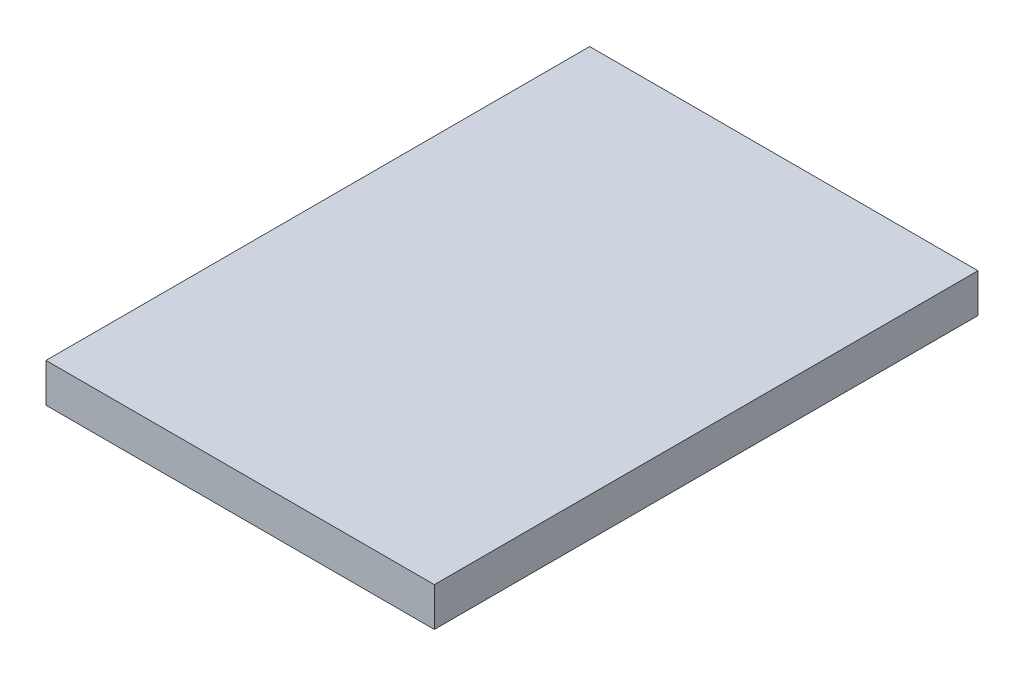
ISO-10303-21;
HEADER;
FILE_DESCRIPTION(('STEP AP214'),'2;1');
FILE_NAME('part.step','',(''),(''),'','','');
FILE_SCHEMA(('AUTOMOTIVE_DESIGN { 1 0 10303 214 1 1 1 1 }'));
ENDSEC;
DATA;
#1=APPLICATION_CONTEXT('core data for automotive mechanical design processes');
#2=APPLICATION_PROTOCOL_DEFINITION('international standard','automotive_design',2000,#1);
#3=PRODUCT_CONTEXT('',#1,'mechanical');
#4=PRODUCT('Part','Part','',(#3));
#5=PRODUCT_RELATED_PRODUCT_CATEGORY('part','',(#4));
#6=PRODUCT_DEFINITION_FORMATION('','',#4);
#7=PRODUCT_DEFINITION_CONTEXT('part definition',#1,'design');
#8=PRODUCT_DEFINITION('design','',#6,#7);
#9=PRODUCT_DEFINITION_SHAPE('','',#8);
#10=(LENGTH_UNIT() NAMED_UNIT(*) SI_UNIT(.MILLI.,.METRE.));
#11=(NAMED_UNIT(*) PLANE_ANGLE_UNIT() SI_UNIT($,.RADIAN.));
#12=(NAMED_UNIT(*) SI_UNIT($,.STERADIAN.) SOLID_ANGLE_UNIT());
#13=UNCERTAINTY_MEASURE_WITH_UNIT(LENGTH_MEASURE(1.E-05),#10,'distance_accuracy_value','');
#14=(GEOMETRIC_REPRESENTATION_CONTEXT(3) GLOBAL_UNCERTAINTY_ASSIGNED_CONTEXT((#13)) GLOBAL_UNIT_ASSIGNED_CONTEXT((#10,
#11,#12)) REPRESENTATION_CONTEXT('',''));
#15=CARTESIAN_POINT('',(0.,0.,0.));
#16=DIRECTION('',(0.,0.,1.));
#17=DIRECTION('',(1.,0.,0.));
#18=AXIS2_PLACEMENT_3D('',#15,#16,#17);
#19=CARTESIAN_POINT('',(10.,1.,14.));
#20=DIRECTION('',(-1.,0.,0.));
#21=DIRECTION('',(0.,0.,1.));
#22=AXIS2_PLACEMENT_3D('',#19,#20,#21);
#23=PLANE('',#22);
#24=DIRECTION('',(0.,0.,-1.));
#25=VECTOR('',#24,1.);
#26=CARTESIAN_POINT('',(10.,-1.,14.));
#27=LINE('',#26,#25);
#28=CARTESIAN_POINT('',(10.,-1.,14.));
#29=VERTEX_POINT('',#28);
#30=CARTESIAN_POINT('',(10.,-1.,-14.));
#31=VERTEX_POINT('',#30);
#32=EDGE_CURVE('E96',#29,#31,#27,.T.);
#33=ORIENTED_EDGE('',*,*,#32,.T.);
#34=DIRECTION('',(0.,-1.,0.));
#35=VECTOR('',#34,1.);
#36=CARTESIAN_POINT('',(10.,1.,-14.));
#37=LINE('',#36,#35);
#38=CARTESIAN_POINT('',(10.,1.,-14.));
#39=VERTEX_POINT('',#38);
#40=EDGE_CURVE('E11',#39,#31,#37,.T.);
#41=ORIENTED_EDGE('',*,*,#40,.F.);
#42=DIRECTION('',(0.,0.,-1.));
#43=VECTOR('',#42,1.);
#44=CARTESIAN_POINT('',(10.,1.,14.));
#45=LINE('',#44,#43);
#46=CARTESIAN_POINT('',(10.,1.,14.));
#47=VERTEX_POINT('',#46);
#48=EDGE_CURVE('E84',#47,#39,#45,.T.);
#49=ORIENTED_EDGE('',*,*,#48,.F.);
#50=DIRECTION('',(0.,-1.,0.));
#51=VECTOR('',#50,1.);
#52=CARTESIAN_POINT('',(10.,1.,14.));
#53=LINE('',#52,#51);
#54=EDGE_CURVE('E92',#47,#29,#53,.T.);
#55=ORIENTED_EDGE('',*,*,#54,.T.);
#56=EDGE_LOOP('',(#33,#41,#49,#55));
#57=FACE_BOUND('',#56,.T.);
#58=ADVANCED_FACE('F33',(#57),#23,.F.);
#59=CARTESIAN_POINT('',(-10.,1.,-14.));
#60=DIRECTION('',(0.,0.,1.));
#61=DIRECTION('',(1.,0.,0.));
#62=AXIS2_PLACEMENT_3D('',#59,#60,#61);
#63=PLANE('',#62);
#64=DIRECTION('',(-1.,0.,0.));
#65=VECTOR('',#64,1.);
#66=CARTESIAN_POINT('',(-10.,-1.,-14.));
#67=LINE('',#66,#65);
#68=CARTESIAN_POINT('',(-10.,-1.,-14.));
#69=VERTEX_POINT('',#68);
#70=EDGE_CURVE('E88',#31,#69,#67,.T.);
#71=ORIENTED_EDGE('',*,*,#70,.T.);
#72=DIRECTION('',(0.,-1.,0.));
#73=VECTOR('',#72,1.);
#74=CARTESIAN_POINT('',(-10.,1.,-14.));
#75=LINE('',#74,#73);
#76=CARTESIAN_POINT('',(-10.,1.,-14.));
#77=VERTEX_POINT('',#76);
#78=EDGE_CURVE('E41',#77,#69,#75,.T.);
#79=ORIENTED_EDGE('',*,*,#78,.F.);
#80=DIRECTION('',(-1.,0.,0.));
#81=VECTOR('',#80,1.);
#82=CARTESIAN_POINT('',(-10.,1.,-14.));
#83=LINE('',#82,#81);
#84=EDGE_CURVE('E79',#39,#77,#83,.T.);
#85=ORIENTED_EDGE('',*,*,#84,.F.);
#86=ORIENTED_EDGE('',*,*,#40,.T.);
#87=EDGE_LOOP('',(#71,#79,#85,#86));
#88=FACE_BOUND('',#87,.T.);
#89=ADVANCED_FACE('F87',(#88),#63,.F.);
#90=CARTESIAN_POINT('',(-10.,1.,14.));
#91=DIRECTION('',(1.,0.,0.));
#92=DIRECTION('',(0.,0.,-1.));
#93=AXIS2_PLACEMENT_3D('',#90,#91,#92);
#94=PLANE('',#93);
#95=DIRECTION('',(0.,0.,1.));
#96=VECTOR('',#95,1.);
#97=CARTESIAN_POINT('',(-10.,-1.,14.));
#98=LINE('',#97,#96);
#99=CARTESIAN_POINT('',(-10.,-1.,14.));
#100=VERTEX_POINT('',#99);
#101=EDGE_CURVE('E66',#69,#100,#98,.T.);
#102=ORIENTED_EDGE('',*,*,#101,.T.);
#103=DIRECTION('',(0.,-1.,0.));
#104=VECTOR('',#103,1.);
#105=CARTESIAN_POINT('',(-10.,1.,14.));
#106=LINE('',#105,#104);
#107=CARTESIAN_POINT('',(-10.,1.,14.));
#108=VERTEX_POINT('',#107);
#109=EDGE_CURVE('E89',#108,#100,#106,.T.);
#110=ORIENTED_EDGE('',*,*,#109,.F.);
#111=DIRECTION('',(0.,0.,1.));
#112=VECTOR('',#111,1.);
#113=CARTESIAN_POINT('',(-10.,1.,14.));
#114=LINE('',#113,#112);
#115=EDGE_CURVE('E82',#77,#108,#114,.T.);
#116=ORIENTED_EDGE('',*,*,#115,.F.);
#117=ORIENTED_EDGE('',*,*,#78,.T.);
#118=EDGE_LOOP('',(#102,#110,#116,#117));
#119=FACE_BOUND('',#118,.T.);
#120=ADVANCED_FACE('F90',(#119),#94,.F.);
#121=CARTESIAN_POINT('',(-10.,1.,14.));
#122=DIRECTION('',(0.,0.,-1.));
#123=DIRECTION('',(-1.,0.,0.));
#124=AXIS2_PLACEMENT_3D('',#121,#122,#123);
#125=PLANE('',#124);
#126=DIRECTION('',(1.,0.,0.));
#127=VECTOR('',#126,1.);
#128=CARTESIAN_POINT('',(-10.,-1.,14.));
#129=LINE('',#128,#127);
#130=EDGE_CURVE('E72',#100,#29,#129,.T.);
#131=ORIENTED_EDGE('',*,*,#130,.T.);
#132=ORIENTED_EDGE('',*,*,#54,.F.);
#133=DIRECTION('',(1.,0.,0.));
#134=VECTOR('',#133,1.);
#135=CARTESIAN_POINT('',(-10.,1.,14.));
#136=LINE('',#135,#134);
#137=EDGE_CURVE('E49',#108,#47,#136,.T.);
#138=ORIENTED_EDGE('',*,*,#137,.F.);
#139=ORIENTED_EDGE('',*,*,#109,.T.);
#140=EDGE_LOOP('',(#131,#132,#138,#139));
#141=FACE_BOUND('',#140,.T.);
#142=ADVANCED_FACE('F103',(#141),#125,.F.);
#143=CARTESIAN_POINT('',(0.,1.,0.));
#144=DIRECTION('',(0.,-1.,0.));
#145=DIRECTION('',(0.,0.,-1.));
#146=AXIS2_PLACEMENT_3D('',#143,#144,#145);
#147=PLANE('',#146);
#148=ORIENTED_EDGE('',*,*,#48,.T.);
#149=ORIENTED_EDGE('',*,*,#84,.T.);
#150=ORIENTED_EDGE('',*,*,#115,.T.);
#151=ORIENTED_EDGE('',*,*,#137,.T.);
#152=EDGE_LOOP('',(#148,#149,#150,#151));
#153=FACE_BOUND('',#152,.T.);
#154=ADVANCED_FACE('F80',(#153),#147,.F.);
#155=CARTESIAN_POINT('',(0.,-1.,0.));
#156=DIRECTION('',(0.,-1.,0.));
#157=DIRECTION('',(0.,0.,-1.));
#158=AXIS2_PLACEMENT_3D('',#155,#156,#157);
#159=PLANE('',#158);
#160=ORIENTED_EDGE('',*,*,#32,.F.);
#161=ORIENTED_EDGE('',*,*,#130,.F.);
#162=ORIENTED_EDGE('',*,*,#101,.F.);
#163=ORIENTED_EDGE('',*,*,#70,.F.);
#164=EDGE_LOOP('',(#160,#161,#162,#163));
#165=FACE_BOUND('',#164,.T.);
#166=ADVANCED_FACE('F106',(#165),#159,.T.);
#167=CLOSED_SHELL('',(#58,#89,#120,#142,#154,#166));
#168=MANIFOLD_SOLID_BREP('B2',#167);
#169=ADVANCED_BREP_SHAPE_REPRESENTATION('',(#18,#168),#14);
#170=SHAPE_DEFINITION_REPRESENTATION(#9,#169);
ENDSEC;
END-ISO-10303-21;
